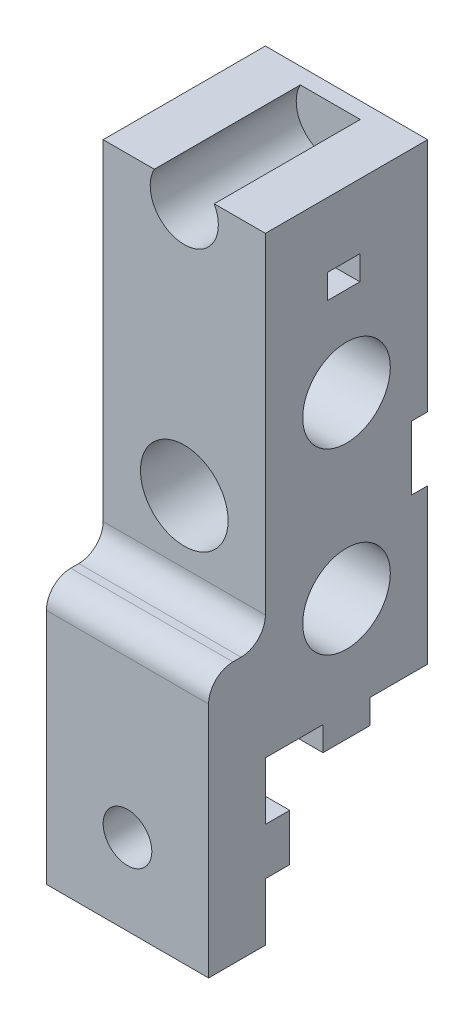
ISO-10303-21;
HEADER;
FILE_DESCRIPTION(('STEP AP214'),'2;1');
FILE_NAME('part.step','',(''),(''),'','','');
FILE_SCHEMA(('AUTOMOTIVE_DESIGN { 1 0 10303 214 1 1 1 1 }'));
ENDSEC;
DATA;
#1=APPLICATION_CONTEXT('core data for automotive mechanical design processes');
#2=APPLICATION_PROTOCOL_DEFINITION('international standard','automotive_design',2000,#1);
#3=PRODUCT_CONTEXT('',#1,'mechanical');
#4=PRODUCT('Part','Part','',(#3));
#5=PRODUCT_RELATED_PRODUCT_CATEGORY('part','',(#4));
#6=PRODUCT_DEFINITION_FORMATION('','',#4);
#7=PRODUCT_DEFINITION_CONTEXT('part definition',#1,'design');
#8=PRODUCT_DEFINITION('design','',#6,#7);
#9=PRODUCT_DEFINITION_SHAPE('','',#8);
#10=(LENGTH_UNIT() NAMED_UNIT(*) SI_UNIT(.MILLI.,.METRE.));
#11=(NAMED_UNIT(*) PLANE_ANGLE_UNIT() SI_UNIT($,.RADIAN.));
#12=(NAMED_UNIT(*) SI_UNIT($,.STERADIAN.) SOLID_ANGLE_UNIT());
#13=UNCERTAINTY_MEASURE_WITH_UNIT(LENGTH_MEASURE(1.E-05),#10,'distance_accuracy_value','');
#14=(GEOMETRIC_REPRESENTATION_CONTEXT(3) GLOBAL_UNCERTAINTY_ASSIGNED_CONTEXT((#13)) GLOBAL_UNIT_ASSIGNED_CONTEXT((#10,
#11,#12)) REPRESENTATION_CONTEXT('',''));
#15=CARTESIAN_POINT('',(0.,0.,0.));
#16=DIRECTION('',(0.,0.,1.));
#17=DIRECTION('',(1.,0.,0.));
#18=AXIS2_PLACEMENT_3D('',#15,#16,#17);
#19=CARTESIAN_POINT('',(0.,3.09214401315137,10.));
#20=DIRECTION('',(0.,0.,-1.));
#21=DIRECTION('',(0.,1.,0.));
#22=AXIS2_PLACEMENT_3D('',#19,#20,#21);
#23=PLANE('',#22);
#24=CARTESIAN_POINT('',(10.,-19.1578559868486,10.));
#25=DIRECTION('',(0.,0.,1.));
#26=DIRECTION('',(1.,0.,0.));
#27=AXIS2_PLACEMENT_3D('',#24,#25,#26);
#28=CIRCLE('',#27,3.);
#29=CARTESIAN_POINT('',(13.,-19.1578559868486,10.));
#30=VERTEX_POINT('',#29);
#31=EDGE_CURVE('E312',#30,#30,#28,.T.);
#32=ORIENTED_EDGE('',*,*,#31,.T.);
#33=EDGE_LOOP('',(#32));
#34=FACE_BOUND('',#33,.T.);
#35=DIRECTION('',(0.,1.,0.));
#36=VECTOR('',#35,1.);
#37=CARTESIAN_POINT('',(17.,-16.2578559868486,10.));
#38=LINE('',#37,#36);
#39=CARTESIAN_POINT('',(17.,-22.0578559868486,10.));
#40=VERTEX_POINT('',#39);
#41=CARTESIAN_POINT('',(17.,-16.2578559868486,10.));
#42=VERTEX_POINT('',#41);
#43=EDGE_CURVE('E685',#40,#42,#38,.T.);
#44=ORIENTED_EDGE('',*,*,#43,.F.);
#45=DIRECTION('',(-1.,0.,0.));
#46=VECTOR('',#45,1.);
#47=CARTESIAN_POINT('',(17.,-22.0578559868486,10.));
#48=LINE('',#47,#46);
#49=CARTESIAN_POINT('',(20.,-22.0578559868486,10.));
#50=VERTEX_POINT('',#49);
#51=EDGE_CURVE('E689',#50,#40,#48,.T.);
#52=ORIENTED_EDGE('',*,*,#51,.F.);
#53=DIRECTION('',(0.,1.,0.));
#54=VECTOR('',#53,1.);
#55=CARTESIAN_POINT('',(20.,3.09214401315137,10.));
#56=LINE('',#55,#54);
#57=CARTESIAN_POINT('',(20.,-29.1578559868486,10.));
#58=VERTEX_POINT('',#57);
#59=EDGE_CURVE('E281',#58,#50,#56,.T.);
#60=ORIENTED_EDGE('',*,*,#59,.F.);
#61=DIRECTION('',(1.,0.,0.));
#62=VECTOR('',#61,1.);
#63=CARTESIAN_POINT('',(0.,-29.1578559868486,10.));
#64=LINE('',#63,#62);
#65=CARTESIAN_POINT('',(0.,-29.1578559868486,10.));
#66=VERTEX_POINT('',#65);
#67=EDGE_CURVE('E534',#66,#58,#64,.T.);
#68=ORIENTED_EDGE('',*,*,#67,.F.);
#69=DIRECTION('',(0.,1.,0.));
#70=VECTOR('',#69,1.);
#71=CARTESIAN_POINT('',(0.,3.09214401315137,10.));
#72=LINE('',#71,#70);
#73=CARTESIAN_POINT('',(0.,-22.0578559868486,10.));
#74=VERTEX_POINT('',#73);
#75=EDGE_CURVE('E366',#66,#74,#72,.T.);
#76=ORIENTED_EDGE('',*,*,#75,.T.);
#77=DIRECTION('',(-1.,0.,0.));
#78=VECTOR('',#77,1.);
#79=CARTESIAN_POINT('',(3.,-22.0578559868486,10.));
#80=LINE('',#79,#78);
#81=CARTESIAN_POINT('',(3.,-22.0578559868486,10.));
#82=VERTEX_POINT('',#81);
#83=EDGE_CURVE('E294',#82,#74,#80,.T.);
#84=ORIENTED_EDGE('',*,*,#83,.F.);
#85=DIRECTION('',(0.,-1.,0.));
#86=VECTOR('',#85,1.);
#87=CARTESIAN_POINT('',(3.,-16.2578559868486,10.));
#88=LINE('',#87,#86);
#89=CARTESIAN_POINT('',(3.,-16.2578559868486,10.));
#90=VERTEX_POINT('',#89);
#91=EDGE_CURVE('E284',#90,#82,#88,.T.);
#92=ORIENTED_EDGE('',*,*,#91,.F.);
#93=DIRECTION('',(1.,0.,0.));
#94=VECTOR('',#93,1.);
#95=CARTESIAN_POINT('',(3.,-16.2578559868486,10.));
#96=LINE('',#95,#94);
#97=CARTESIAN_POINT('',(0.,-16.2578559868486,10.));
#98=VERTEX_POINT('',#97);
#99=EDGE_CURVE('E282',#98,#90,#96,.T.);
#100=ORIENTED_EDGE('',*,*,#99,.F.);
#101=CARTESIAN_POINT('',(0.,-9.15785598684864,10.));
#102=VERTEX_POINT('',#101);
#103=EDGE_CURVE('E359',#98,#102,#72,.T.);
#104=ORIENTED_EDGE('',*,*,#103,.T.);
#105=DIRECTION('',(-1.,0.,0.));
#106=VECTOR('',#105,1.);
#107=CARTESIAN_POINT('',(20.,-9.15785598684864,10.));
#108=LINE('',#107,#106);
#109=CARTESIAN_POINT('',(20.,-9.15785598684864,10.));
#110=VERTEX_POINT('',#109);
#111=EDGE_CURVE('E389',#110,#102,#108,.T.);
#112=ORIENTED_EDGE('',*,*,#111,.F.);
#113=CARTESIAN_POINT('',(20.,-16.2578559868486,10.));
#114=VERTEX_POINT('',#113);
#115=EDGE_CURVE('E50',#114,#110,#56,.T.);
#116=ORIENTED_EDGE('',*,*,#115,.F.);
#117=DIRECTION('',(1.,0.,0.));
#118=VECTOR('',#117,1.);
#119=CARTESIAN_POINT('',(17.,-16.2578559868486,10.));
#120=LINE('',#119,#118);
#121=EDGE_CURVE('E274',#42,#114,#120,.T.);
#122=ORIENTED_EDGE('',*,*,#121,.F.);
#123=EDGE_LOOP('',(#44,#52,#60,#68,#76,#84,#92,#100,#104,#112,#116,#122));
#124=FACE_BOUND('',#123,.T.);
#125=ADVANCED_FACE('F46',(#34,#124),#23,.T.);
#126=CARTESIAN_POINT('',(0.,6.09214401315137,13.));
#127=DIRECTION('',(-1.,0.,0.));
#128=DIRECTION('',(0.,0.,1.));
#129=AXIS2_PLACEMENT_3D('',#126,#127,#128);
#130=CYLINDRICAL_SURFACE('',#129,3.);
#131=DIRECTION('',(-1.,0.,0.));
#132=VECTOR('',#131,1.);
#133=CARTESIAN_POINT('',(0.,3.09214401315136,13.));
#134=LINE('',#133,#132);
#135=CARTESIAN_POINT('',(20.,3.09214401315136,13.));
#136=VERTEX_POINT('',#135);
#137=CARTESIAN_POINT('',(0.,3.09214401315136,13.));
#138=VERTEX_POINT('',#137);
#139=EDGE_CURVE('E374',#136,#138,#134,.T.);
#140=ORIENTED_EDGE('',*,*,#139,.F.);
#141=CARTESIAN_POINT('',(20.,6.09214401315137,13.));
#142=DIRECTION('',(1.,0.,0.));
#143=DIRECTION('',(0.,0.,-1.));
#144=AXIS2_PLACEMENT_3D('',#141,#142,#143);
#145=CIRCLE('',#144,3.);
#146=CARTESIAN_POINT('',(20.,6.09214401315137,10.));
#147=VERTEX_POINT('',#146);
#148=EDGE_CURVE('E56',#136,#147,#145,.T.);
#149=ORIENTED_EDGE('',*,*,#148,.T.);
#150=DIRECTION('',(-1.,0.,0.));
#151=VECTOR('',#150,1.);
#152=CARTESIAN_POINT('',(20.,6.09214401315136,10.));
#153=LINE('',#152,#151);
#154=CARTESIAN_POINT('',(0.,6.09214401315137,10.));
#155=VERTEX_POINT('',#154);
#156=EDGE_CURVE('E371',#155,#147,#153,.F.);
#157=ORIENTED_EDGE('',*,*,#156,.F.);
#158=CARTESIAN_POINT('',(0.,6.09214401315137,13.));
#159=DIRECTION('',(1.,0.,0.));
#160=DIRECTION('',(0.,0.,-1.));
#161=AXIS2_PLACEMENT_3D('',#158,#159,#160);
#162=CIRCLE('',#161,3.);
#163=EDGE_CURVE('E14',#155,#138,#162,.F.);
#164=ORIENTED_EDGE('',*,*,#163,.T.);
#165=EDGE_LOOP('',(#140,#149,#157,#164));
#166=FACE_BOUND('',#165,.T.);
#167=ADVANCED_FACE('F48',(#166),#130,.F.);
#168=CARTESIAN_POINT('',(0.,0.0921440131513645,14.));
#169=DIRECTION('',(1.,0.,0.));
#170=DIRECTION('',(0.,0.,-1.));
#171=AXIS2_PLACEMENT_3D('',#168,#169,#170);
#172=CYLINDRICAL_SURFACE('',#171,3.);
#173=DIRECTION('',(1.,0.,0.));
#174=VECTOR('',#173,1.);
#175=CARTESIAN_POINT('',(0.,3.09214401315136,14.));
#176=LINE('',#175,#174);
#177=CARTESIAN_POINT('',(0.,3.09214401315136,14.));
#178=VERTEX_POINT('',#177);
#179=CARTESIAN_POINT('',(20.,3.09214401315136,14.));
#180=VERTEX_POINT('',#179);
#181=EDGE_CURVE('E504',#178,#180,#176,.T.);
#182=ORIENTED_EDGE('',*,*,#181,.F.);
#183=CARTESIAN_POINT('',(0.,0.0921440131513645,14.));
#184=DIRECTION('',(1.,0.,0.));
#185=DIRECTION('',(0.,0.,-1.));
#186=AXIS2_PLACEMENT_3D('',#183,#184,#185);
#187=CIRCLE('',#186,3.);
#188=CARTESIAN_POINT('',(0.,0.0921440131513643,17.));
#189=VERTEX_POINT('',#188);
#190=EDGE_CURVE('E516',#189,#178,#187,.F.);
#191=ORIENTED_EDGE('',*,*,#190,.F.);
#192=DIRECTION('',(1.,0.,0.));
#193=VECTOR('',#192,1.);
#194=CARTESIAN_POINT('',(0.,0.0921440131513643,17.));
#195=LINE('',#194,#193);
#196=CARTESIAN_POINT('',(20.,0.0921440131513643,17.));
#197=VERTEX_POINT('',#196);
#198=EDGE_CURVE('E507',#197,#189,#195,.F.);
#199=ORIENTED_EDGE('',*,*,#198,.F.);
#200=CARTESIAN_POINT('',(20.,0.0921440131513645,14.));
#201=DIRECTION('',(1.,0.,0.));
#202=DIRECTION('',(0.,0.,-1.));
#203=AXIS2_PLACEMENT_3D('',#200,#201,#202);
#204=CIRCLE('',#203,3.);
#205=EDGE_CURVE('E377',#180,#197,#204,.T.);
#206=ORIENTED_EDGE('',*,*,#205,.F.);
#207=EDGE_LOOP('',(#182,#191,#199,#206));
#208=FACE_BOUND('',#207,.T.);
#209=ADVANCED_FACE('F525',(#208),#172,.T.);
#210=CARTESIAN_POINT('',(20.,-9.15785598684864,-10.));
#211=DIRECTION('',(0.,0.,1.));
#212=DIRECTION('',(1.,0.,0.));
#213=AXIS2_PLACEMENT_3D('',#210,#211,#212);
#214=PLANE('',#213);
#215=DIRECTION('',(0.,1.,0.));
#216=VECTOR('',#215,1.);
#217=CARTESIAN_POINT('',(20.,-9.15785598684864,-10.));
#218=LINE('',#217,#216);
#219=CARTESIAN_POINT('',(20.,17.7870774726662,-10.));
#220=VERTEX_POINT('',#219);
#221=CARTESIAN_POINT('',(20.,46.8421440131514,-10.));
#222=VERTEX_POINT('',#221);
#223=EDGE_CURVE('E671',#220,#222,#218,.T.);
#224=ORIENTED_EDGE('',*,*,#223,.F.);
#225=CARTESIAN_POINT('',(10.,13.8421440131514,-10.));
#226=DIRECTION('',(0.,0.,-1.));
#227=DIRECTION('',(-1.,0.,0.));
#228=AXIS2_PLACEMENT_3D('',#225,#226,#227);
#229=CIRCLE('',#228,10.75);
#230=CARTESIAN_POINT('',(0.,17.7870774726662,-10.));
#231=VERTEX_POINT('',#230);
#232=EDGE_CURVE('E323',#231,#220,#229,.T.);
#233=ORIENTED_EDGE('',*,*,#232,.F.);
#234=DIRECTION('',(0.,1.,0.));
#235=VECTOR('',#234,1.);
#236=CARTESIAN_POINT('',(0.,-9.15785598684864,-10.));
#237=LINE('',#236,#235);
#238=CARTESIAN_POINT('',(0.,46.8421440131514,-10.));
#239=VERTEX_POINT('',#238);
#240=EDGE_CURVE('E469',#231,#239,#237,.T.);
#241=ORIENTED_EDGE('',*,*,#240,.T.);
#242=DIRECTION('',(-1.,0.,0.));
#243=VECTOR('',#242,1.);
#244=CARTESIAN_POINT('',(20.,46.8421440131514,-10.));
#245=LINE('',#244,#243);
#246=EDGE_CURVE('E404',#222,#239,#245,.T.);
#247=ORIENTED_EDGE('',*,*,#246,.F.);
#248=EDGE_LOOP('',(#224,#233,#241,#247));
#249=FACE_BOUND('',#248,.T.);
#250=ADVANCED_FACE('F481',(#249),#214,.F.);
#251=CARTESIAN_POINT('',(10.,13.8421440131514,-9.99999999999999));
#252=DIRECTION('',(0.,0.,1.));
#253=DIRECTION('',(1.,0.,0.));
#254=AXIS2_PLACEMENT_3D('',#251,#252,#253);
#255=CYLINDRICAL_SURFACE('',#254,5.4);
#256=CARTESIAN_POINT('',(10.,13.8421440131514,10.));
#257=DIRECTION('',(0.,0.,1.));
#258=DIRECTION('',(1.,0.,0.));
#259=AXIS2_PLACEMENT_3D('',#256,#257,#258);
#260=CIRCLE('',#259,5.4);
#261=CARTESIAN_POINT('',(15.4,13.8421440131514,10.));
#262=VERTEX_POINT('',#261);
#263=EDGE_CURVE('E349',#262,#262,#260,.T.);
#264=ORIENTED_EDGE('',*,*,#263,.T.);
#265=EDGE_LOOP('',(#264));
#266=FACE_BOUND('',#265,.T.);
#267=CARTESIAN_POINT('',(10.,13.8421440131514,-8.));
#268=DIRECTION('',(0.,0.,-1.));
#269=DIRECTION('',(-1.,0.,0.));
#270=AXIS2_PLACEMENT_3D('',#267,#268,#269);
#271=CIRCLE('',#270,5.4);
#272=CARTESIAN_POINT('',(4.6,13.8421440131514,-8.));
#273=VERTEX_POINT('',#272);
#274=EDGE_CURVE('E321',#273,#273,#271,.F.);
#275=ORIENTED_EDGE('',*,*,#274,.F.);
#276=EDGE_LOOP('',(#275));
#277=FACE_BOUND('',#276,.T.);
#278=ADVANCED_FACE('F579',(#266,#277),#255,.F.);
#279=CARTESIAN_POINT('',(20.,0.,0.));
#280=DIRECTION('',(1.,0.,0.));
#281=DIRECTION('',(0.,0.,-1.));
#282=AXIS2_PLACEMENT_3D('',#279,#280,#281);
#283=PLANE('',#282);
#284=ORIENTED_EDGE('',*,*,#148,.F.);
#285=DIRECTION('',(0.,0.,1.));
#286=VECTOR('',#285,1.);
#287=CARTESIAN_POINT('',(20.,3.09214401315137,10.));
#288=LINE('',#287,#286);
#289=EDGE_CURVE('E352',#136,#180,#288,.T.);
#290=ORIENTED_EDGE('',*,*,#289,.T.);
#291=ORIENTED_EDGE('',*,*,#205,.T.);
#292=DIRECTION('',(0.,-1.,0.));
#293=VECTOR('',#292,1.);
#294=CARTESIAN_POINT('',(20.,3.09214401315136,17.));
#295=LINE('',#294,#293);
#296=CARTESIAN_POINT('',(20.,-29.1578559868486,17.));
#297=VERTEX_POINT('',#296);
#298=EDGE_CURVE('E362',#197,#297,#295,.T.);
#299=ORIENTED_EDGE('',*,*,#298,.T.);
#300=DIRECTION('',(0.,0.,-1.));
#301=VECTOR('',#300,1.);
#302=CARTESIAN_POINT('',(20.,-29.1578559868486,17.));
#303=LINE('',#302,#301);
#304=EDGE_CURVE('E531',#297,#58,#303,.T.);
#305=ORIENTED_EDGE('',*,*,#304,.T.);
#306=ORIENTED_EDGE('',*,*,#59,.T.);
#307=DIRECTION('',(0.,0.,1.));
#308=VECTOR('',#307,1.);
#309=CARTESIAN_POINT('',(20.,-22.0578559868486,7.00000000000001));
#310=LINE('',#309,#308);
#311=CARTESIAN_POINT('',(20.,-22.0578559868486,7.00000000000001));
#312=VERTEX_POINT('',#311);
#313=EDGE_CURVE('E262',#312,#50,#310,.T.);
#314=ORIENTED_EDGE('',*,*,#313,.F.);
#315=DIRECTION('',(0.,-1.,0.));
#316=VECTOR('',#315,1.);
#317=CARTESIAN_POINT('',(20.,-16.2578559868486,7.00000000000001));
#318=LINE('',#317,#316);
#319=CARTESIAN_POINT('',(20.,-16.2578559868486,7.00000000000001));
#320=VERTEX_POINT('',#319);
#321=EDGE_CURVE('E269',#320,#312,#318,.T.);
#322=ORIENTED_EDGE('',*,*,#321,.F.);
#323=DIRECTION('',(0.,0.,1.));
#324=VECTOR('',#323,1.);
#325=CARTESIAN_POINT('',(20.,-16.2578559868486,7.00000000000001));
#326=LINE('',#325,#324);
#327=EDGE_CURVE('E64',#320,#114,#326,.T.);
#328=ORIENTED_EDGE('',*,*,#327,.T.);
#329=ORIENTED_EDGE('',*,*,#115,.T.);
#330=DIRECTION('',(0.,0.,-1.));
#331=VECTOR('',#330,1.);
#332=CARTESIAN_POINT('',(20.,-9.15785598684864,10.));
#333=LINE('',#332,#331);
#334=CARTESIAN_POINT('',(20.,-9.15785598684864,2.9));
#335=VERTEX_POINT('',#334);
#336=EDGE_CURVE('E678',#110,#335,#333,.T.);
#337=ORIENTED_EDGE('',*,*,#336,.T.);
#338=DIRECTION('',(0.,-1.,0.));
#339=VECTOR('',#338,1.);
#340=CARTESIAN_POINT('',(20.,-12.1578559868486,2.9));
#341=LINE('',#340,#339);
#342=CARTESIAN_POINT('',(20.,-12.1578559868486,2.9));
#343=VERTEX_POINT('',#342);
#344=EDGE_CURVE('E443',#335,#343,#341,.T.);
#345=ORIENTED_EDGE('',*,*,#344,.T.);
#346=DIRECTION('',(0.,0.,-1.));
#347=VECTOR('',#346,1.);
#348=CARTESIAN_POINT('',(20.,-12.1578559868486,-2.9));
#349=LINE('',#348,#347);
#350=CARTESIAN_POINT('',(20.,-12.1578559868486,-2.9));
#351=VERTEX_POINT('',#350);
#352=EDGE_CURVE('E462',#343,#351,#349,.T.);
#353=ORIENTED_EDGE('',*,*,#352,.T.);
#354=DIRECTION('',(0.,1.,0.));
#355=VECTOR('',#354,1.);
#356=CARTESIAN_POINT('',(20.,-9.15785598684864,-2.9));
#357=LINE('',#356,#355);
#358=CARTESIAN_POINT('',(20.,-9.15785598684864,-2.9));
#359=VERTEX_POINT('',#358);
#360=EDGE_CURVE('E429',#351,#359,#357,.T.);
#361=ORIENTED_EDGE('',*,*,#360,.T.);
#362=DIRECTION('',(0.,0.,-1.));
#363=VECTOR('',#362,1.);
#364=CARTESIAN_POINT('',(20.,-9.15785598684864,-2.9));
#365=LINE('',#364,#363);
#366=CARTESIAN_POINT('',(20.,-9.15785598684864,-10.));
#367=VERTEX_POINT('',#366);
#368=EDGE_CURVE('E424',#359,#367,#365,.T.);
#369=ORIENTED_EDGE('',*,*,#368,.T.);
#370=CARTESIAN_POINT('',(20.,9.89721055363649,-10.));
#371=VERTEX_POINT('',#370);
#372=EDGE_CURVE('E668',#367,#371,#218,.T.);
#373=ORIENTED_EDGE('',*,*,#372,.T.);
#374=DIRECTION('',(0.,0.,-1.));
#375=VECTOR('',#374,1.);
#376=CARTESIAN_POINT('',(20.,9.89721055363649,-8.));
#377=LINE('',#376,#375);
#378=CARTESIAN_POINT('',(20.,9.89721055363649,-8.));
#379=VERTEX_POINT('',#378);
#380=EDGE_CURVE('E338',#379,#371,#377,.T.);
#381=ORIENTED_EDGE('',*,*,#380,.F.);
#382=DIRECTION('',(0.,1.,0.));
#383=VECTOR('',#382,1.);
#384=CARTESIAN_POINT('',(20.,0.,-8.));
#385=LINE('',#384,#383);
#386=CARTESIAN_POINT('',(20.,17.7870774726662,-8.));
#387=VERTEX_POINT('',#386);
#388=EDGE_CURVE('E327',#379,#387,#385,.T.);
#389=ORIENTED_EDGE('',*,*,#388,.T.);
#390=DIRECTION('',(0.,0.,-1.));
#391=VECTOR('',#390,1.);
#392=CARTESIAN_POINT('',(20.,17.7870774726662,-8.));
#393=LINE('',#392,#391);
#394=EDGE_CURVE('E336',#220,#387,#393,.F.);
#395=ORIENTED_EDGE('',*,*,#394,.F.);
#396=ORIENTED_EDGE('',*,*,#223,.T.);
#397=DIRECTION('',(0.,0.,1.));
#398=VECTOR('',#397,1.);
#399=CARTESIAN_POINT('',(20.,46.8421440131514,10.));
#400=LINE('',#399,#398);
#401=CARTESIAN_POINT('',(20.,46.8421440131514,10.));
#402=VERTEX_POINT('',#401);
#403=EDGE_CURVE('E490',#222,#402,#400,.T.);
#404=ORIENTED_EDGE('',*,*,#403,.T.);
#405=DIRECTION('',(0.,-1.,0.));
#406=VECTOR('',#405,1.);
#407=CARTESIAN_POINT('',(20.,46.8421440131514,10.));
#408=LINE('',#407,#406);
#409=EDGE_CURVE('E384',#402,#147,#408,.T.);
#410=ORIENTED_EDGE('',*,*,#409,.T.);
#411=EDGE_LOOP('',(#284,#290,#291,#299,#305,#306,#314,#322,#328,#329,#337,#345,#353,#361,#369,
#373,#381,#389,#395,#396,#404,#410));
#412=FACE_BOUND('',#411,.T.);
#413=CARTESIAN_POINT('',(20.,24.8421440131514,0.));
#414=DIRECTION('',(1.,0.,0.));
#415=DIRECTION('',(0.,0.,-1.));
#416=AXIS2_PLACEMENT_3D('',#413,#414,#415);
#417=CIRCLE('',#416,5.4);
#418=CARTESIAN_POINT('',(20.,24.8421440131514,-5.4));
#419=VERTEX_POINT('',#418);
#420=EDGE_CURVE('E969',#419,#419,#417,.T.);
#421=ORIENTED_EDGE('',*,*,#420,.F.);
#422=EDGE_LOOP('',(#421));
#423=FACE_BOUND('',#422,.T.);
#424=DIRECTION('',(0.,0.,1.));
#425=VECTOR('',#424,1.);
#426=CARTESIAN_POINT('',(20.,38.8421440131514,2.35328043414837));
#427=LINE('',#426,#425);
#428=CARTESIAN_POINT('',(20.,38.8421440131514,-1.64671956585163));
#429=VERTEX_POINT('',#428);
#430=CARTESIAN_POINT('',(20.,38.8421440131514,2.35328043414837));
#431=VERTEX_POINT('',#430);
#432=EDGE_CURVE('E974',#429,#431,#427,.T.);
#433=ORIENTED_EDGE('',*,*,#432,.F.);
#434=DIRECTION('',(0.,1.,0.));
#435=VECTOR('',#434,1.);
#436=CARTESIAN_POINT('',(20.,38.8421440131514,-1.64671956585163));
#437=LINE('',#436,#435);
#438=CARTESIAN_POINT('',(20.,35.8421440131514,-1.64671956585163));
#439=VERTEX_POINT('',#438);
#440=EDGE_CURVE('E959',#439,#429,#437,.T.);
#441=ORIENTED_EDGE('',*,*,#440,.F.);
#442=DIRECTION('',(0.,0.,-1.));
#443=VECTOR('',#442,1.);
#444=CARTESIAN_POINT('',(20.,35.8421440131514,2.35328043414837));
#445=LINE('',#444,#443);
#446=CARTESIAN_POINT('',(20.,35.8421440131514,2.35328043414837));
#447=VERTEX_POINT('',#446);
#448=EDGE_CURVE('E955',#447,#439,#445,.T.);
#449=ORIENTED_EDGE('',*,*,#448,.F.);
#450=DIRECTION('',(0.,-1.,0.));
#451=VECTOR('',#450,1.);
#452=CARTESIAN_POINT('',(20.,38.8421440131514,2.35328043414837));
#453=LINE('',#452,#451);
#454=EDGE_CURVE('E971',#431,#447,#453,.T.);
#455=ORIENTED_EDGE('',*,*,#454,.F.);
#456=EDGE_LOOP('',(#433,#441,#449,#455));
#457=FACE_BOUND('',#456,.T.);
#458=CARTESIAN_POINT('',(20.,2.84214401315136,0.));
#459=DIRECTION('',(1.,0.,0.));
#460=DIRECTION('',(0.,0.,-1.));
#461=AXIS2_PLACEMENT_3D('',#458,#459,#460);
#462=CIRCLE('',#461,5.4);
#463=CARTESIAN_POINT('',(20.,2.84214401315136,-5.4));
#464=VERTEX_POINT('',#463);
#465=EDGE_CURVE('E980',#464,#464,#462,.T.);
#466=ORIENTED_EDGE('',*,*,#465,.F.);
#467=EDGE_LOOP('',(#466));
#468=FACE_BOUND('',#467,.T.);
#469=ADVANCED_FACE('F277',(#412,#423,#457,#468),#283,.T.);
#470=CARTESIAN_POINT('',(0.,0.,0.));
#471=DIRECTION('',(1.,0.,0.));
#472=DIRECTION('',(0.,0.,-1.));
#473=AXIS2_PLACEMENT_3D('',#470,#471,#472);
#474=PLANE('',#473);
#475=CARTESIAN_POINT('',(0.,24.8421440131514,0.));
#476=DIRECTION('',(1.,0.,0.));
#477=DIRECTION('',(0.,0.,-1.));
#478=AXIS2_PLACEMENT_3D('',#475,#476,#477);
#479=CIRCLE('',#478,5.4);
#480=CARTESIAN_POINT('',(0.,24.8421440131514,-5.4));
#481=VERTEX_POINT('',#480);
#482=EDGE_CURVE('E977',#481,#481,#479,.T.);
#483=ORIENTED_EDGE('',*,*,#482,.T.);
#484=EDGE_LOOP('',(#483));
#485=FACE_BOUND('',#484,.T.);
#486=DIRECTION('',(0.,-1.,0.));
#487=VECTOR('',#486,1.);
#488=CARTESIAN_POINT('',(0.,3.09214401315136,17.));
#489=LINE('',#488,#487);
#490=CARTESIAN_POINT('',(0.,-29.1578559868486,17.));
#491=VERTEX_POINT('',#490);
#492=EDGE_CURVE('E353',#189,#491,#489,.T.);
#493=ORIENTED_EDGE('',*,*,#492,.F.);
#494=ORIENTED_EDGE('',*,*,#190,.T.);
#495=DIRECTION('',(0.,0.,1.));
#496=VECTOR('',#495,1.);
#497=CARTESIAN_POINT('',(0.,3.09214401315137,10.));
#498=LINE('',#497,#496);
#499=EDGE_CURVE('E356',#138,#178,#498,.T.);
#500=ORIENTED_EDGE('',*,*,#499,.F.);
#501=ORIENTED_EDGE('',*,*,#163,.F.);
#502=DIRECTION('',(0.,-1.,0.));
#503=VECTOR('',#502,1.);
#504=CARTESIAN_POINT('',(0.,46.8421440131514,10.));
#505=LINE('',#504,#503);
#506=CARTESIAN_POINT('',(0.,46.8421440131514,10.));
#507=VERTEX_POINT('',#506);
#508=EDGE_CURVE('E410',#507,#155,#505,.T.);
#509=ORIENTED_EDGE('',*,*,#508,.F.);
#510=DIRECTION('',(0.,0.,1.));
#511=VECTOR('',#510,1.);
#512=CARTESIAN_POINT('',(0.,46.8421440131514,10.));
#513=LINE('',#512,#511);
#514=EDGE_CURVE('E413',#239,#507,#513,.T.);
#515=ORIENTED_EDGE('',*,*,#514,.F.);
#516=ORIENTED_EDGE('',*,*,#240,.F.);
#517=DIRECTION('',(0.,0.,-1.));
#518=VECTOR('',#517,1.);
#519=CARTESIAN_POINT('',(0.,17.7870774726662,-8.));
#520=LINE('',#519,#518);
#521=CARTESIAN_POINT('',(0.,17.7870774726662,-8.));
#522=VERTEX_POINT('',#521);
#523=EDGE_CURVE('E330',#231,#522,#520,.F.);
#524=ORIENTED_EDGE('',*,*,#523,.T.);
#525=DIRECTION('',(0.,1.,0.));
#526=VECTOR('',#525,1.);
#527=CARTESIAN_POINT('',(0.,0.,-8.));
#528=LINE('',#527,#526);
#529=CARTESIAN_POINT('',(0.,9.89721055363649,-8.));
#530=VERTEX_POINT('',#529);
#531=EDGE_CURVE('E325',#530,#522,#528,.T.);
#532=ORIENTED_EDGE('',*,*,#531,.F.);
#533=DIRECTION('',(0.,0.,-1.));
#534=VECTOR('',#533,1.);
#535=CARTESIAN_POINT('',(0.,9.89721055363649,-8.));
#536=LINE('',#535,#534);
#537=CARTESIAN_POINT('',(0.,9.89721055363649,-10.));
#538=VERTEX_POINT('',#537);
#539=EDGE_CURVE('E333',#530,#538,#536,.T.);
#540=ORIENTED_EDGE('',*,*,#539,.T.);
#541=CARTESIAN_POINT('',(0.,-9.15785598684864,-10.));
#542=VERTEX_POINT('',#541);
#543=EDGE_CURVE('E471',#542,#538,#237,.T.);
#544=ORIENTED_EDGE('',*,*,#543,.F.);
#545=DIRECTION('',(0.,0.,-1.));
#546=VECTOR('',#545,1.);
#547=CARTESIAN_POINT('',(0.,-9.15785598684864,-2.9));
#548=LINE('',#547,#546);
#549=CARTESIAN_POINT('',(0.,-9.15785598684864,-2.9));
#550=VERTEX_POINT('',#549);
#551=EDGE_CURVE('E467',#550,#542,#548,.T.);
#552=ORIENTED_EDGE('',*,*,#551,.F.);
#553=DIRECTION('',(0.,1.,0.));
#554=VECTOR('',#553,1.);
#555=CARTESIAN_POINT('',(0.,-9.15785598684864,-2.9));
#556=LINE('',#555,#554);
#557=CARTESIAN_POINT('',(0.,-12.1578559868486,-2.9));
#558=VERTEX_POINT('',#557);
#559=EDGE_CURVE('E422',#558,#550,#556,.T.);
#560=ORIENTED_EDGE('',*,*,#559,.F.);
#561=DIRECTION('',(0.,0.,-1.));
#562=VECTOR('',#561,1.);
#563=CARTESIAN_POINT('',(0.,-12.1578559868486,-2.9));
#564=LINE('',#563,#562);
#565=CARTESIAN_POINT('',(0.,-12.1578559868486,2.9));
#566=VERTEX_POINT('',#565);
#567=EDGE_CURVE('E420',#566,#558,#564,.T.);
#568=ORIENTED_EDGE('',*,*,#567,.F.);
#569=DIRECTION('',(0.,-1.,0.));
#570=VECTOR('',#569,1.);
#571=CARTESIAN_POINT('',(0.,-12.1578559868486,2.9));
#572=LINE('',#571,#570);
#573=CARTESIAN_POINT('',(0.,-9.15785598684864,2.9));
#574=VERTEX_POINT('',#573);
#575=EDGE_CURVE('E418',#574,#566,#572,.T.);
#576=ORIENTED_EDGE('',*,*,#575,.F.);
#577=DIRECTION('',(0.,0.,-1.));
#578=VECTOR('',#577,1.);
#579=CARTESIAN_POINT('',(0.,-9.15785598684864,10.));
#580=LINE('',#579,#578);
#581=EDGE_CURVE('E395',#102,#574,#580,.T.);
#582=ORIENTED_EDGE('',*,*,#581,.F.);
#583=ORIENTED_EDGE('',*,*,#103,.F.);
#584=DIRECTION('',(0.,0.,1.));
#585=VECTOR('',#584,1.);
#586=CARTESIAN_POINT('',(0.,-16.2578559868486,7.00000000000001));
#587=LINE('',#586,#585);
#588=CARTESIAN_POINT('',(0.,-16.2578559868486,7.00000000000001));
#589=VERTEX_POINT('',#588);
#590=EDGE_CURVE('E309',#589,#98,#587,.T.);
#591=ORIENTED_EDGE('',*,*,#590,.F.);
#592=DIRECTION('',(0.,1.,0.));
#593=VECTOR('',#592,1.);
#594=CARTESIAN_POINT('',(0.,-16.2578559868486,7.00000000000001));
#595=LINE('',#594,#593);
#596=CARTESIAN_POINT('',(0.,-22.0578559868486,7.00000000000001));
#597=VERTEX_POINT('',#596);
#598=EDGE_CURVE('E290',#597,#589,#595,.T.);
#599=ORIENTED_EDGE('',*,*,#598,.F.);
#600=DIRECTION('',(0.,0.,1.));
#601=VECTOR('',#600,1.);
#602=CARTESIAN_POINT('',(0.,-22.0578559868486,7.00000000000001));
#603=LINE('',#602,#601);
#604=EDGE_CURVE('E299',#597,#74,#603,.T.);
#605=ORIENTED_EDGE('',*,*,#604,.T.);
#606=ORIENTED_EDGE('',*,*,#75,.F.);
#607=DIRECTION('',(0.,0.,-1.));
#608=VECTOR('',#607,1.);
#609=CARTESIAN_POINT('',(0.,-29.1578559868486,17.));
#610=LINE('',#609,#608);
#611=EDGE_CURVE('E355',#491,#66,#610,.T.);
#612=ORIENTED_EDGE('',*,*,#611,.F.);
#613=EDGE_LOOP('',(#493,#494,#500,#501,#509,#515,#516,#524,#532,#540,#544,#552,#560,#568,#576,
#582,#583,#591,#599,#605,#606,#612));
#614=FACE_BOUND('',#613,.T.);
#615=DIRECTION('',(0.,1.,0.));
#616=VECTOR('',#615,1.);
#617=CARTESIAN_POINT('',(0.,38.8421440131514,-1.64671956585163));
#618=LINE('',#617,#616);
#619=CARTESIAN_POINT('',(0.,35.8421440131514,-1.64671956585163));
#620=VERTEX_POINT('',#619);
#621=CARTESIAN_POINT('',(0.,38.8421440131514,-1.64671956585163));
#622=VERTEX_POINT('',#621);
#623=EDGE_CURVE('E966',#620,#622,#618,.T.);
#624=ORIENTED_EDGE('',*,*,#623,.T.);
#625=DIRECTION('',(0.,0.,1.));
#626=VECTOR('',#625,1.);
#627=CARTESIAN_POINT('',(0.,38.8421440131514,2.35328043414837));
#628=LINE('',#627,#626);
#629=CARTESIAN_POINT('',(0.,38.8421440131514,2.35328043414837));
#630=VERTEX_POINT('',#629);
#631=EDGE_CURVE('E963',#622,#630,#628,.T.);
#632=ORIENTED_EDGE('',*,*,#631,.T.);
#633=DIRECTION('',(0.,-1.,0.));
#634=VECTOR('',#633,1.);
#635=CARTESIAN_POINT('',(0.,38.8421440131514,2.35328043414837));
#636=LINE('',#635,#634);
#637=CARTESIAN_POINT('',(0.,35.8421440131514,2.35328043414837));
#638=VERTEX_POINT('',#637);
#639=EDGE_CURVE('E960',#630,#638,#636,.T.);
#640=ORIENTED_EDGE('',*,*,#639,.T.);
#641=DIRECTION('',(0.,0.,-1.));
#642=VECTOR('',#641,1.);
#643=CARTESIAN_POINT('',(0.,35.8421440131514,2.35328043414837));
#644=LINE('',#643,#642);
#645=EDGE_CURVE('E956',#638,#620,#644,.T.);
#646=ORIENTED_EDGE('',*,*,#645,.T.);
#647=EDGE_LOOP('',(#624,#632,#640,#646));
#648=FACE_BOUND('',#647,.T.);
#649=CARTESIAN_POINT('',(0.,2.84214401315136,0.));
#650=DIRECTION('',(1.,0.,0.));
#651=DIRECTION('',(0.,0.,-1.));
#652=AXIS2_PLACEMENT_3D('',#649,#650,#651);
#653=CIRCLE('',#652,5.4);
#654=CARTESIAN_POINT('',(0.,2.84214401315136,-5.4));
#655=VERTEX_POINT('',#654);
#656=EDGE_CURVE('E537',#655,#655,#653,.T.);
#657=ORIENTED_EDGE('',*,*,#656,.T.);
#658=EDGE_LOOP('',(#657));
#659=FACE_BOUND('',#658,.T.);
#660=ADVANCED_FACE('F449',(#485,#614,#648,#659),#474,.F.);
#661=CARTESIAN_POINT('',(20.,-9.15785598684864,-2.9));
#662=DIRECTION('',(0.,1.,0.));
#663=DIRECTION('',(0.,0.,1.));
#664=AXIS2_PLACEMENT_3D('',#661,#662,#663);
#665=PLANE('',#664);
#666=ORIENTED_EDGE('',*,*,#551,.T.);
#667=DIRECTION('',(-1.,0.,0.));
#668=VECTOR('',#667,1.);
#669=CARTESIAN_POINT('',(20.,-9.15785598684864,-10.));
#670=LINE('',#669,#668);
#671=EDGE_CURVE('E407',#367,#542,#670,.T.);
#672=ORIENTED_EDGE('',*,*,#671,.F.);
#673=ORIENTED_EDGE('',*,*,#368,.F.);
#674=DIRECTION('',(-1.,0.,0.));
#675=VECTOR('',#674,1.);
#676=CARTESIAN_POINT('',(20.,-9.15785598684864,-2.9));
#677=LINE('',#676,#675);
#678=EDGE_CURVE('E425',#359,#550,#677,.T.);
#679=ORIENTED_EDGE('',*,*,#678,.T.);
#680=EDGE_LOOP('',(#666,#672,#673,#679));
#681=FACE_BOUND('',#680,.T.);
#682=ADVANCED_FACE('F620',(#681),#665,.F.);
#683=ORIENTED_EDGE('',*,*,#543,.T.);
#684=EDGE_CURVE('E315',#371,#538,#229,.T.);
#685=ORIENTED_EDGE('',*,*,#684,.F.);
#686=ORIENTED_EDGE('',*,*,#372,.F.);
#687=ORIENTED_EDGE('',*,*,#671,.T.);
#688=EDGE_LOOP('',(#683,#685,#686,#687));
#689=FACE_BOUND('',#688,.T.);
#690=ADVANCED_FACE('F636',(#689),#214,.F.);
#691=CARTESIAN_POINT('',(20.,46.8421440131514,10.));
#692=DIRECTION('',(0.,-1.,0.));
#693=DIRECTION('',(0.,0.,-1.));
#694=AXIS2_PLACEMENT_3D('',#691,#692,#693);
#695=PLANE('',#694);
#696=DIRECTION('',(-1.,0.,0.));
#697=VECTOR('',#696,1.);
#698=CARTESIAN_POINT('',(20.,46.8421440131514,-7.99999999999999));
#699=LINE('',#698,#697);
#700=CARTESIAN_POINT('',(13.6932370625239,46.8421440131514,-7.99999999999999));
#701=VERTEX_POINT('',#700);
#702=CARTESIAN_POINT('',(6.30676293747612,46.8421440131514,-7.99999999999999));
#703=VERTEX_POINT('',#702);
#704=EDGE_CURVE('E498',#701,#703,#699,.T.);
#705=ORIENTED_EDGE('',*,*,#704,.F.);
#706=DIRECTION('',(0.,0.,1.));
#707=VECTOR('',#706,1.);
#708=CARTESIAN_POINT('',(13.6932370625239,46.8421440131514,-7.99999999999999));
#709=LINE('',#708,#707);
#710=CARTESIAN_POINT('',(13.6932370625239,46.8421440131514,10.));
#711=VERTEX_POINT('',#710);
#712=EDGE_CURVE('E346',#701,#711,#709,.T.);
#713=ORIENTED_EDGE('',*,*,#712,.T.);
#714=DIRECTION('',(-1.,0.,0.));
#715=VECTOR('',#714,1.);
#716=CARTESIAN_POINT('',(20.,46.8421440131514,10.));
#717=LINE('',#716,#715);
#718=EDGE_CURVE('E401',#402,#711,#717,.T.);
#719=ORIENTED_EDGE('',*,*,#718,.F.);
#720=ORIENTED_EDGE('',*,*,#403,.F.);
#721=ORIENTED_EDGE('',*,*,#246,.T.);
#722=ORIENTED_EDGE('',*,*,#514,.T.);
#723=CARTESIAN_POINT('',(6.30676293747612,46.8421440131514,10.));
#724=VERTEX_POINT('',#723);
#725=EDGE_CURVE('E393',#724,#507,#717,.T.);
#726=ORIENTED_EDGE('',*,*,#725,.F.);
#727=DIRECTION('',(0.,0.,1.));
#728=VECTOR('',#727,1.);
#729=CARTESIAN_POINT('',(6.30676293747612,46.8421440131514,-7.99999999999999));
#730=LINE('',#729,#728);
#731=EDGE_CURVE('E343',#724,#703,#730,.F.);
#732=ORIENTED_EDGE('',*,*,#731,.T.);
#733=EDGE_LOOP('',(#705,#713,#719,#720,#721,#722,#726,#732));
#734=FACE_BOUND('',#733,.T.);
#735=ADVANCED_FACE('F486',(#734),#695,.F.);
#736=CARTESIAN_POINT('',(20.,46.8421440131514,10.));
#737=DIRECTION('',(0.,0.,-1.));
#738=DIRECTION('',(0.,1.,0.));
#739=AXIS2_PLACEMENT_3D('',#736,#737,#738);
#740=PLANE('',#739);
#741=ORIENTED_EDGE('',*,*,#263,.F.);
#742=EDGE_LOOP('',(#741));
#743=FACE_BOUND('',#742,.T.);
#744=ORIENTED_EDGE('',*,*,#508,.T.);
#745=ORIENTED_EDGE('',*,*,#156,.T.);
#746=ORIENTED_EDGE('',*,*,#409,.F.);
#747=ORIENTED_EDGE('',*,*,#718,.T.);
#748=CARTESIAN_POINT('',(10.,44.8421440131514,10.));
#749=DIRECTION('',(0.,0.,-1.));
#750=DIRECTION('',(0.,1.,0.));
#751=AXIS2_PLACEMENT_3D('',#748,#749,#750);
#752=CIRCLE('',#751,4.2);
#753=EDGE_CURVE('E409',#711,#724,#752,.T.);
#754=ORIENTED_EDGE('',*,*,#753,.T.);
#755=ORIENTED_EDGE('',*,*,#725,.T.);
#756=EDGE_LOOP('',(#744,#745,#746,#747,#754,#755));
#757=FACE_BOUND('',#756,.T.);
#758=ADVANCED_FACE('F494',(#743,#757),#740,.F.);
#759=CARTESIAN_POINT('',(20.,-9.15785598684864,10.));
#760=DIRECTION('',(0.,1.,0.));
#761=DIRECTION('',(0.,0.,1.));
#762=AXIS2_PLACEMENT_3D('',#759,#760,#761);
#763=PLANE('',#762);
#764=ORIENTED_EDGE('',*,*,#581,.T.);
#765=DIRECTION('',(-1.,0.,0.));
#766=VECTOR('',#765,1.);
#767=CARTESIAN_POINT('',(20.,-9.15785598684864,2.9));
#768=LINE('',#767,#766);
#769=EDGE_CURVE('E394',#335,#574,#768,.T.);
#770=ORIENTED_EDGE('',*,*,#769,.F.);
#771=ORIENTED_EDGE('',*,*,#336,.F.);
#772=ORIENTED_EDGE('',*,*,#111,.T.);
#773=EDGE_LOOP('',(#764,#770,#771,#772));
#774=FACE_BOUND('',#773,.T.);
#775=ADVANCED_FACE('F628',(#774),#763,.F.);
#776=CARTESIAN_POINT('',(20.,-12.1578559868486,2.9));
#777=DIRECTION('',(0.,0.,-1.));
#778=DIRECTION('',(0.,1.,0.));
#779=AXIS2_PLACEMENT_3D('',#776,#777,#778);
#780=PLANE('',#779);
#781=ORIENTED_EDGE('',*,*,#575,.T.);
#782=DIRECTION('',(-1.,0.,0.));
#783=VECTOR('',#782,1.);
#784=CARTESIAN_POINT('',(20.,-12.1578559868486,2.9));
#785=LINE('',#784,#783);
#786=EDGE_CURVE('E431',#343,#566,#785,.T.);
#787=ORIENTED_EDGE('',*,*,#786,.F.);
#788=ORIENTED_EDGE('',*,*,#344,.F.);
#789=ORIENTED_EDGE('',*,*,#769,.T.);
#790=EDGE_LOOP('',(#781,#787,#788,#789));
#791=FACE_BOUND('',#790,.T.);
#792=ADVANCED_FACE('F442',(#791),#780,.F.);
#793=CARTESIAN_POINT('',(20.,-12.1578559868486,-2.9));
#794=DIRECTION('',(0.,1.,0.));
#795=DIRECTION('',(0.,0.,1.));
#796=AXIS2_PLACEMENT_3D('',#793,#794,#795);
#797=PLANE('',#796);
#798=ORIENTED_EDGE('',*,*,#567,.T.);
#799=DIRECTION('',(-1.,0.,0.));
#800=VECTOR('',#799,1.);
#801=CARTESIAN_POINT('',(20.,-12.1578559868486,-2.9));
#802=LINE('',#801,#800);
#803=EDGE_CURVE('E428',#351,#558,#802,.T.);
#804=ORIENTED_EDGE('',*,*,#803,.F.);
#805=ORIENTED_EDGE('',*,*,#352,.F.);
#806=ORIENTED_EDGE('',*,*,#786,.T.);
#807=EDGE_LOOP('',(#798,#804,#805,#806));
#808=FACE_BOUND('',#807,.T.);
#809=ADVANCED_FACE('F455',(#808),#797,.F.);
#810=CARTESIAN_POINT('',(20.,-9.15785598684864,-2.9));
#811=DIRECTION('',(0.,0.,1.));
#812=DIRECTION('',(0.,-1.,0.));
#813=AXIS2_PLACEMENT_3D('',#810,#811,#812);
#814=PLANE('',#813);
#815=ORIENTED_EDGE('',*,*,#559,.T.);
#816=ORIENTED_EDGE('',*,*,#678,.F.);
#817=ORIENTED_EDGE('',*,*,#360,.F.);
#818=ORIENTED_EDGE('',*,*,#803,.T.);
#819=EDGE_LOOP('',(#815,#816,#817,#818));
#820=FACE_BOUND('',#819,.T.);
#821=ADVANCED_FACE('F458',(#820),#814,.F.);
#822=CARTESIAN_POINT('',(20.,38.8421440131514,-1.64671956585163));
#823=DIRECTION('',(0.,0.,1.));
#824=DIRECTION('',(0.,-1.,0.));
#825=AXIS2_PLACEMENT_3D('',#822,#823,#824);
#826=PLANE('',#825);
#827=ORIENTED_EDGE('',*,*,#623,.F.);
#828=DIRECTION('',(-1.,0.,0.));
#829=VECTOR('',#828,1.);
#830=CARTESIAN_POINT('',(20.,35.8421440131514,-1.64671956585163));
#831=LINE('',#830,#829);
#832=EDGE_CURVE('E952',#439,#620,#831,.T.);
#833=ORIENTED_EDGE('',*,*,#832,.F.);
#834=ORIENTED_EDGE('',*,*,#440,.T.);
#835=DIRECTION('',(-1.,0.,0.));
#836=VECTOR('',#835,1.);
#837=CARTESIAN_POINT('',(20.,38.8421440131514,-1.64671956585163));
#838=LINE('',#837,#836);
#839=EDGE_CURVE('E470',#429,#622,#838,.T.);
#840=ORIENTED_EDGE('',*,*,#839,.T.);
#841=EDGE_LOOP('',(#827,#833,#834,#840));
#842=FACE_BOUND('',#841,.T.);
#843=ADVANCED_FACE('F611',(#842),#826,.T.);
#844=CARTESIAN_POINT('',(20.,38.8421440131514,2.35328043414837));
#845=DIRECTION('',(0.,-1.,0.));
#846=DIRECTION('',(0.,0.,-1.));
#847=AXIS2_PLACEMENT_3D('',#844,#845,#846);
#848=PLANE('',#847);
#849=ORIENTED_EDGE('',*,*,#631,.F.);
#850=ORIENTED_EDGE('',*,*,#839,.F.);
#851=ORIENTED_EDGE('',*,*,#432,.T.);
#852=DIRECTION('',(-1.,0.,0.));
#853=VECTOR('',#852,1.);
#854=CARTESIAN_POINT('',(20.,38.8421440131514,2.35328043414837));
#855=LINE('',#854,#853);
#856=EDGE_CURVE('E948',#431,#630,#855,.T.);
#857=ORIENTED_EDGE('',*,*,#856,.T.);
#858=EDGE_LOOP('',(#849,#850,#851,#857));
#859=FACE_BOUND('',#858,.T.);
#860=ADVANCED_FACE('F607',(#859),#848,.T.);
#861=CARTESIAN_POINT('',(20.,38.8421440131514,2.35328043414837));
#862=DIRECTION('',(0.,0.,-1.));
#863=DIRECTION('',(0.,1.,0.));
#864=AXIS2_PLACEMENT_3D('',#861,#862,#863);
#865=PLANE('',#864);
#866=ORIENTED_EDGE('',*,*,#639,.F.);
#867=ORIENTED_EDGE('',*,*,#856,.F.);
#868=ORIENTED_EDGE('',*,*,#454,.T.);
#869=DIRECTION('',(-1.,0.,0.));
#870=VECTOR('',#869,1.);
#871=CARTESIAN_POINT('',(20.,35.8421440131514,2.35328043414837));
#872=LINE('',#871,#870);
#873=EDGE_CURVE('E950',#447,#638,#872,.T.);
#874=ORIENTED_EDGE('',*,*,#873,.T.);
#875=EDGE_LOOP('',(#866,#867,#868,#874));
#876=FACE_BOUND('',#875,.T.);
#877=ADVANCED_FACE('F603',(#876),#865,.T.);
#878=CARTESIAN_POINT('',(20.,35.8421440131514,2.35328043414837));
#879=DIRECTION('',(0.,1.,0.));
#880=DIRECTION('',(0.,0.,1.));
#881=AXIS2_PLACEMENT_3D('',#878,#879,#880);
#882=PLANE('',#881);
#883=ORIENTED_EDGE('',*,*,#645,.F.);
#884=ORIENTED_EDGE('',*,*,#873,.F.);
#885=ORIENTED_EDGE('',*,*,#448,.T.);
#886=ORIENTED_EDGE('',*,*,#832,.T.);
#887=EDGE_LOOP('',(#883,#884,#885,#886));
#888=FACE_BOUND('',#887,.T.);
#889=ADVANCED_FACE('F599',(#888),#882,.T.);
#890=CARTESIAN_POINT('',(20.,24.8421440131514,0.));
#891=DIRECTION('',(-1.,0.,0.));
#892=DIRECTION('',(0.,0.,1.));
#893=AXIS2_PLACEMENT_3D('',#890,#891,#892);
#894=CYLINDRICAL_SURFACE('',#893,5.4);
#895=ORIENTED_EDGE('',*,*,#420,.T.);
#896=EDGE_LOOP('',(#895));
#897=FACE_BOUND('',#896,.T.);
#898=ORIENTED_EDGE('',*,*,#482,.F.);
#899=EDGE_LOOP('',(#898));
#900=FACE_BOUND('',#899,.T.);
#901=ADVANCED_FACE('F595',(#897,#900),#894,.F.);
#902=CARTESIAN_POINT('',(20.,2.84214401315136,0.));
#903=DIRECTION('',(-1.,0.,0.));
#904=DIRECTION('',(0.,0.,1.));
#905=AXIS2_PLACEMENT_3D('',#902,#903,#904);
#906=CYLINDRICAL_SURFACE('',#905,5.4);
#907=ORIENTED_EDGE('',*,*,#465,.T.);
#908=EDGE_LOOP('',(#907));
#909=FACE_BOUND('',#908,.T.);
#910=ORIENTED_EDGE('',*,*,#656,.F.);
#911=EDGE_LOOP('',(#910));
#912=FACE_BOUND('',#911,.T.);
#913=ADVANCED_FACE('F591',(#909,#912),#906,.F.);
#914=CARTESIAN_POINT('',(0.,3.09214401315137,10.));
#915=DIRECTION('',(0.,1.,0.));
#916=DIRECTION('',(0.,0.,1.));
#917=AXIS2_PLACEMENT_3D('',#914,#915,#916);
#918=PLANE('',#917);
#919=ORIENTED_EDGE('',*,*,#289,.F.);
#920=ORIENTED_EDGE('',*,*,#139,.T.);
#921=ORIENTED_EDGE('',*,*,#499,.T.);
#922=ORIENTED_EDGE('',*,*,#181,.T.);
#923=EDGE_LOOP('',(#919,#920,#921,#922));
#924=FACE_BOUND('',#923,.T.);
#925=ADVANCED_FACE('F584',(#924),#918,.T.);
#926=CARTESIAN_POINT('',(0.,-29.1578559868486,17.));
#927=DIRECTION('',(0.,-1.,0.));
#928=DIRECTION('',(0.,0.,-1.));
#929=AXIS2_PLACEMENT_3D('',#926,#927,#928);
#930=PLANE('',#929);
#931=ORIENTED_EDGE('',*,*,#304,.F.);
#932=DIRECTION('',(1.,0.,0.));
#933=VECTOR('',#932,1.);
#934=CARTESIAN_POINT('',(0.,-29.1578559868486,17.));
#935=LINE('',#934,#933);
#936=EDGE_CURVE('E529',#491,#297,#935,.T.);
#937=ORIENTED_EDGE('',*,*,#936,.F.);
#938=ORIENTED_EDGE('',*,*,#611,.T.);
#939=ORIENTED_EDGE('',*,*,#67,.T.);
#940=EDGE_LOOP('',(#931,#937,#938,#939));
#941=FACE_BOUND('',#940,.T.);
#942=ADVANCED_FACE('F581',(#941),#930,.T.);
#943=CARTESIAN_POINT('',(0.,3.09214401315136,17.));
#944=DIRECTION('',(0.,0.,1.));
#945=DIRECTION('',(0.,-1.,0.));
#946=AXIS2_PLACEMENT_3D('',#943,#944,#945);
#947=PLANE('',#946);
#948=CARTESIAN_POINT('',(10.,-19.1578559868486,17.));
#949=DIRECTION('',(0.,0.,1.));
#950=DIRECTION('',(1.,0.,0.));
#951=AXIS2_PLACEMENT_3D('',#948,#949,#950);
#952=CIRCLE('',#951,3.);
#953=CARTESIAN_POINT('',(13.,-19.1578559868486,17.));
#954=VERTEX_POINT('',#953);
#955=EDGE_CURVE('E311',#954,#954,#952,.T.);
#956=ORIENTED_EDGE('',*,*,#955,.F.);
#957=EDGE_LOOP('',(#956));
#958=FACE_BOUND('',#957,.T.);
#959=ORIENTED_EDGE('',*,*,#298,.F.);
#960=ORIENTED_EDGE('',*,*,#198,.T.);
#961=ORIENTED_EDGE('',*,*,#492,.T.);
#962=ORIENTED_EDGE('',*,*,#936,.T.);
#963=EDGE_LOOP('',(#959,#960,#961,#962));
#964=FACE_BOUND('',#963,.T.);
#965=ADVANCED_FACE('F527',(#958,#964),#947,.T.);
#966=CARTESIAN_POINT('',(10.,44.8421440131514,-7.99999999999999));
#967=DIRECTION('',(0.,0.,1.));
#968=DIRECTION('',(1.,0.,0.));
#969=AXIS2_PLACEMENT_3D('',#966,#967,#968);
#970=PLANE('',#969);
#971=ORIENTED_EDGE('',*,*,#704,.T.);
#972=CARTESIAN_POINT('',(10.,44.8421440131514,-7.99999999999999));
#973=DIRECTION('',(0.,0.,1.));
#974=DIRECTION('',(1.,0.,0.));
#975=AXIS2_PLACEMENT_3D('',#972,#973,#974);
#976=CIRCLE('',#975,4.2);
#977=EDGE_CURVE('E340',#703,#701,#976,.T.);
#978=ORIENTED_EDGE('',*,*,#977,.T.);
#979=EDGE_LOOP('',(#971,#978));
#980=FACE_BOUND('',#979,.T.);
#981=ADVANCED_FACE('F503',(#980),#970,.T.);
#982=CARTESIAN_POINT('',(10.,44.8421440131514,-7.99999999999999));
#983=DIRECTION('',(0.,0.,1.));
#984=DIRECTION('',(1.,0.,0.));
#985=AXIS2_PLACEMENT_3D('',#982,#983,#984);
#986=CYLINDRICAL_SURFACE('',#985,4.2);
#987=ORIENTED_EDGE('',*,*,#977,.F.);
#988=ORIENTED_EDGE('',*,*,#731,.F.);
#989=ORIENTED_EDGE('',*,*,#753,.F.);
#990=ORIENTED_EDGE('',*,*,#712,.F.);
#991=EDGE_LOOP('',(#987,#988,#989,#990));
#992=FACE_BOUND('',#991,.T.);
#993=ADVANCED_FACE('F501',(#992),#986,.F.);
#994=CARTESIAN_POINT('',(10.,13.8421440131514,-8.));
#995=DIRECTION('',(0.,0.,-1.));
#996=DIRECTION('',(-1.,0.,0.));
#997=AXIS2_PLACEMENT_3D('',#994,#995,#996);
#998=CYLINDRICAL_SURFACE('',#997,10.75);
#999=ORIENTED_EDGE('',*,*,#380,.T.);
#1000=ORIENTED_EDGE('',*,*,#684,.T.);
#1001=ORIENTED_EDGE('',*,*,#539,.F.);
#1002=CARTESIAN_POINT('',(10.,13.8421440131514,-8.));
#1003=DIRECTION('',(0.,0.,-1.));
#1004=DIRECTION('',(-1.,0.,0.));
#1005=AXIS2_PLACEMENT_3D('',#1002,#1003,#1004);
#1006=CIRCLE('',#1005,10.75);
#1007=EDGE_CURVE('E322',#379,#530,#1006,.T.);
#1008=ORIENTED_EDGE('',*,*,#1007,.F.);
#1009=EDGE_LOOP('',(#999,#1000,#1001,#1008));
#1010=FACE_BOUND('',#1009,.T.);
#1011=ADVANCED_FACE('F669',(#1010),#998,.F.);
#1012=ORIENTED_EDGE('',*,*,#394,.T.);
#1013=EDGE_CURVE('E318',#522,#387,#1006,.T.);
#1014=ORIENTED_EDGE('',*,*,#1013,.F.);
#1015=ORIENTED_EDGE('',*,*,#523,.F.);
#1016=ORIENTED_EDGE('',*,*,#232,.T.);
#1017=EDGE_LOOP('',(#1012,#1014,#1015,#1016));
#1018=FACE_BOUND('',#1017,.T.);
#1019=ADVANCED_FACE('F657',(#1018),#998,.F.);
#1020=CARTESIAN_POINT('',(10.,13.8421440131514,-8.));
#1021=DIRECTION('',(0.,0.,-1.));
#1022=DIRECTION('',(-1.,0.,0.));
#1023=AXIS2_PLACEMENT_3D('',#1020,#1021,#1022);
#1024=PLANE('',#1023);
#1025=ORIENTED_EDGE('',*,*,#274,.T.);
#1026=EDGE_LOOP('',(#1025));
#1027=FACE_BOUND('',#1026,.T.);
#1028=ORIENTED_EDGE('',*,*,#1007,.T.);
#1029=ORIENTED_EDGE('',*,*,#531,.T.);
#1030=ORIENTED_EDGE('',*,*,#1013,.T.);
#1031=ORIENTED_EDGE('',*,*,#388,.F.);
#1032=EDGE_LOOP('',(#1028,#1029,#1030,#1031));
#1033=FACE_BOUND('',#1032,.T.);
#1034=ADVANCED_FACE('F567',(#1027,#1033),#1024,.T.);
#1035=CARTESIAN_POINT('',(10.,-19.1578559868486,10.));
#1036=DIRECTION('',(0.,0.,1.));
#1037=DIRECTION('',(1.,0.,0.));
#1038=AXIS2_PLACEMENT_3D('',#1035,#1036,#1037);
#1039=CYLINDRICAL_SURFACE('',#1038,3.);
#1040=ORIENTED_EDGE('',*,*,#31,.F.);
#1041=EDGE_LOOP('',(#1040));
#1042=FACE_BOUND('',#1041,.T.);
#1043=ORIENTED_EDGE('',*,*,#955,.T.);
#1044=EDGE_LOOP('',(#1043));
#1045=FACE_BOUND('',#1044,.T.);
#1046=ADVANCED_FACE('F560',(#1042,#1045),#1039,.F.);
#1047=CARTESIAN_POINT('',(3.,-16.2578559868486,7.00000000000001));
#1048=DIRECTION('',(0.,-1.,0.));
#1049=DIRECTION('',(0.,0.,-1.));
#1050=AXIS2_PLACEMENT_3D('',#1047,#1048,#1049);
#1051=PLANE('',#1050);
#1052=ORIENTED_EDGE('',*,*,#99,.T.);
#1053=DIRECTION('',(0.,0.,1.));
#1054=VECTOR('',#1053,1.);
#1055=CARTESIAN_POINT('',(3.,-16.2578559868486,7.00000000000001));
#1056=LINE('',#1055,#1054);
#1057=CARTESIAN_POINT('',(3.,-16.2578559868486,7.00000000000001));
#1058=VERTEX_POINT('',#1057);
#1059=EDGE_CURVE('E306',#1058,#90,#1056,.T.);
#1060=ORIENTED_EDGE('',*,*,#1059,.F.);
#1061=DIRECTION('',(1.,0.,0.));
#1062=VECTOR('',#1061,1.);
#1063=CARTESIAN_POINT('',(3.,-16.2578559868486,7.00000000000001));
#1064=LINE('',#1063,#1062);
#1065=EDGE_CURVE('E293',#589,#1058,#1064,.T.);
#1066=ORIENTED_EDGE('',*,*,#1065,.F.);
#1067=ORIENTED_EDGE('',*,*,#590,.T.);
#1068=EDGE_LOOP('',(#1052,#1060,#1066,#1067));
#1069=FACE_BOUND('',#1068,.T.);
#1070=ADVANCED_FACE('F558',(#1069),#1051,.F.);
#1071=CARTESIAN_POINT('',(3.,-16.2578559868486,7.00000000000001));
#1072=DIRECTION('',(-1.,0.,0.));
#1073=DIRECTION('',(0.,0.,1.));
#1074=AXIS2_PLACEMENT_3D('',#1071,#1072,#1073);
#1075=PLANE('',#1074);
#1076=ORIENTED_EDGE('',*,*,#91,.T.);
#1077=DIRECTION('',(0.,0.,1.));
#1078=VECTOR('',#1077,1.);
#1079=CARTESIAN_POINT('',(3.,-22.0578559868486,7.00000000000001));
#1080=LINE('',#1079,#1078);
#1081=CARTESIAN_POINT('',(3.,-22.0578559868486,7.00000000000001));
#1082=VERTEX_POINT('',#1081);
#1083=EDGE_CURVE('E72',#1082,#82,#1080,.T.);
#1084=ORIENTED_EDGE('',*,*,#1083,.F.);
#1085=DIRECTION('',(0.,-1.,0.));
#1086=VECTOR('',#1085,1.);
#1087=CARTESIAN_POINT('',(3.,-16.2578559868486,7.00000000000001));
#1088=LINE('',#1087,#1086);
#1089=EDGE_CURVE('E296',#1058,#1082,#1088,.T.);
#1090=ORIENTED_EDGE('',*,*,#1089,.F.);
#1091=ORIENTED_EDGE('',*,*,#1059,.T.);
#1092=EDGE_LOOP('',(#1076,#1084,#1090,#1091));
#1093=FACE_BOUND('',#1092,.T.);
#1094=ADVANCED_FACE('F554',(#1093),#1075,.F.);
#1095=CARTESIAN_POINT('',(3.,-22.0578559868486,7.00000000000001));
#1096=DIRECTION('',(0.,1.,0.));
#1097=DIRECTION('',(0.,0.,1.));
#1098=AXIS2_PLACEMENT_3D('',#1095,#1096,#1097);
#1099=PLANE('',#1098);
#1100=ORIENTED_EDGE('',*,*,#83,.T.);
#1101=ORIENTED_EDGE('',*,*,#604,.F.);
#1102=DIRECTION('',(-1.,0.,0.));
#1103=VECTOR('',#1102,1.);
#1104=CARTESIAN_POINT('',(3.,-22.0578559868486,7.00000000000001));
#1105=LINE('',#1104,#1103);
#1106=EDGE_CURVE('E298',#1082,#597,#1105,.T.);
#1107=ORIENTED_EDGE('',*,*,#1106,.F.);
#1108=ORIENTED_EDGE('',*,*,#1083,.T.);
#1109=EDGE_LOOP('',(#1100,#1101,#1107,#1108));
#1110=FACE_BOUND('',#1109,.T.);
#1111=ADVANCED_FACE('F548',(#1110),#1099,.F.);
#1112=CARTESIAN_POINT('',(0.,0.,7.00000000000001));
#1113=DIRECTION('',(0.,0.,-1.));
#1114=DIRECTION('',(-1.,0.,0.));
#1115=AXIS2_PLACEMENT_3D('',#1112,#1113,#1114);
#1116=PLANE('',#1115);
#1117=ORIENTED_EDGE('',*,*,#598,.T.);
#1118=ORIENTED_EDGE('',*,*,#1065,.T.);
#1119=ORIENTED_EDGE('',*,*,#1089,.T.);
#1120=ORIENTED_EDGE('',*,*,#1106,.T.);
#1121=EDGE_LOOP('',(#1117,#1118,#1119,#1120));
#1122=FACE_BOUND('',#1121,.T.);
#1123=ADVANCED_FACE('F550',(#1122),#1116,.T.);
#1124=CARTESIAN_POINT('',(17.,-22.0578559868486,7.00000000000001));
#1125=DIRECTION('',(0.,1.,0.));
#1126=DIRECTION('',(0.,0.,1.));
#1127=AXIS2_PLACEMENT_3D('',#1124,#1125,#1126);
#1128=PLANE('',#1127);
#1129=ORIENTED_EDGE('',*,*,#51,.T.);
#1130=DIRECTION('',(0.,0.,1.));
#1131=VECTOR('',#1130,1.);
#1132=CARTESIAN_POINT('',(17.,-22.0578559868486,7.00000000000001));
#1133=LINE('',#1132,#1131);
#1134=CARTESIAN_POINT('',(17.,-22.0578559868486,7.00000000000001));
#1135=VERTEX_POINT('',#1134);
#1136=EDGE_CURVE('E265',#1135,#40,#1133,.T.);
#1137=ORIENTED_EDGE('',*,*,#1136,.F.);
#1138=DIRECTION('',(-1.,0.,0.));
#1139=VECTOR('',#1138,1.);
#1140=CARTESIAN_POINT('',(17.,-22.0578559868486,7.00000000000001));
#1141=LINE('',#1140,#1139);
#1142=EDGE_CURVE('E258',#312,#1135,#1141,.T.);
#1143=ORIENTED_EDGE('',*,*,#1142,.F.);
#1144=ORIENTED_EDGE('',*,*,#313,.T.);
#1145=EDGE_LOOP('',(#1129,#1137,#1143,#1144));
#1146=FACE_BOUND('',#1145,.T.);
#1147=ADVANCED_FACE('F260',(#1146),#1128,.F.);
#1148=CARTESIAN_POINT('',(17.,-16.2578559868486,7.00000000000001));
#1149=DIRECTION('',(1.,0.,0.));
#1150=DIRECTION('',(0.,0.,-1.));
#1151=AXIS2_PLACEMENT_3D('',#1148,#1149,#1150);
#1152=PLANE('',#1151);
#1153=ORIENTED_EDGE('',*,*,#43,.T.);
#1154=DIRECTION('',(0.,0.,1.));
#1155=VECTOR('',#1154,1.);
#1156=CARTESIAN_POINT('',(17.,-16.2578559868486,7.00000000000001));
#1157=LINE('',#1156,#1155);
#1158=CARTESIAN_POINT('',(17.,-16.2578559868486,7.00000000000001));
#1159=VERTEX_POINT('',#1158);
#1160=EDGE_CURVE('E286',#1159,#42,#1157,.T.);
#1161=ORIENTED_EDGE('',*,*,#1160,.F.);
#1162=DIRECTION('',(0.,1.,0.));
#1163=VECTOR('',#1162,1.);
#1164=CARTESIAN_POINT('',(17.,-16.2578559868486,7.00000000000001));
#1165=LINE('',#1164,#1163);
#1166=EDGE_CURVE('E268',#1135,#1159,#1165,.T.);
#1167=ORIENTED_EDGE('',*,*,#1166,.F.);
#1168=ORIENTED_EDGE('',*,*,#1136,.T.);
#1169=EDGE_LOOP('',(#1153,#1161,#1167,#1168));
#1170=FACE_BOUND('',#1169,.T.);
#1171=ADVANCED_FACE('F696',(#1170),#1152,.F.);
#1172=CARTESIAN_POINT('',(17.,-16.2578559868486,7.00000000000001));
#1173=DIRECTION('',(0.,-1.,0.));
#1174=DIRECTION('',(0.,0.,-1.));
#1175=AXIS2_PLACEMENT_3D('',#1172,#1173,#1174);
#1176=PLANE('',#1175);
#1177=ORIENTED_EDGE('',*,*,#121,.T.);
#1178=ORIENTED_EDGE('',*,*,#327,.F.);
#1179=DIRECTION('',(1.,0.,0.));
#1180=VECTOR('',#1179,1.);
#1181=CARTESIAN_POINT('',(17.,-16.2578559868486,7.00000000000001));
#1182=LINE('',#1181,#1180);
#1183=EDGE_CURVE('E273',#1159,#320,#1182,.T.);
#1184=ORIENTED_EDGE('',*,*,#1183,.F.);
#1185=ORIENTED_EDGE('',*,*,#1160,.T.);
#1186=EDGE_LOOP('',(#1177,#1178,#1184,#1185));
#1187=FACE_BOUND('',#1186,.T.);
#1188=ADVANCED_FACE('F694',(#1187),#1176,.F.);
#1189=CARTESIAN_POINT('',(0.,0.,7.00000000000001));
#1190=DIRECTION('',(0.,0.,1.));
#1191=DIRECTION('',(1.,0.,0.));
#1192=AXIS2_PLACEMENT_3D('',#1189,#1190,#1191);
#1193=PLANE('',#1192);
#1194=ORIENTED_EDGE('',*,*,#321,.T.);
#1195=ORIENTED_EDGE('',*,*,#1142,.T.);
#1196=ORIENTED_EDGE('',*,*,#1166,.T.);
#1197=ORIENTED_EDGE('',*,*,#1183,.T.);
#1198=EDGE_LOOP('',(#1194,#1195,#1196,#1197));
#1199=FACE_BOUND('',#1198,.T.);
#1200=ADVANCED_FACE('F271',(#1199),#1193,.F.);
#1201=CLOSED_SHELL('',(#125,#167,#209,#250,#278,#469,#660,#682,#690,#735,#758,#775,#792,#809,
#821,#843,#860,#877,#889,#901,#913,#925,#942,#965,#981,#993,#1011,#1019,#1034,#1046,#1070,#1094,
#1111,#1123,#1147,#1171,#1188,#1200));
#1202=MANIFOLD_SOLID_BREP('B2',#1201);
#1203=ADVANCED_BREP_SHAPE_REPRESENTATION('',(#18,#1202),#14);
#1204=SHAPE_DEFINITION_REPRESENTATION(#9,#1203);
ENDSEC;
END-ISO-10303-21;
